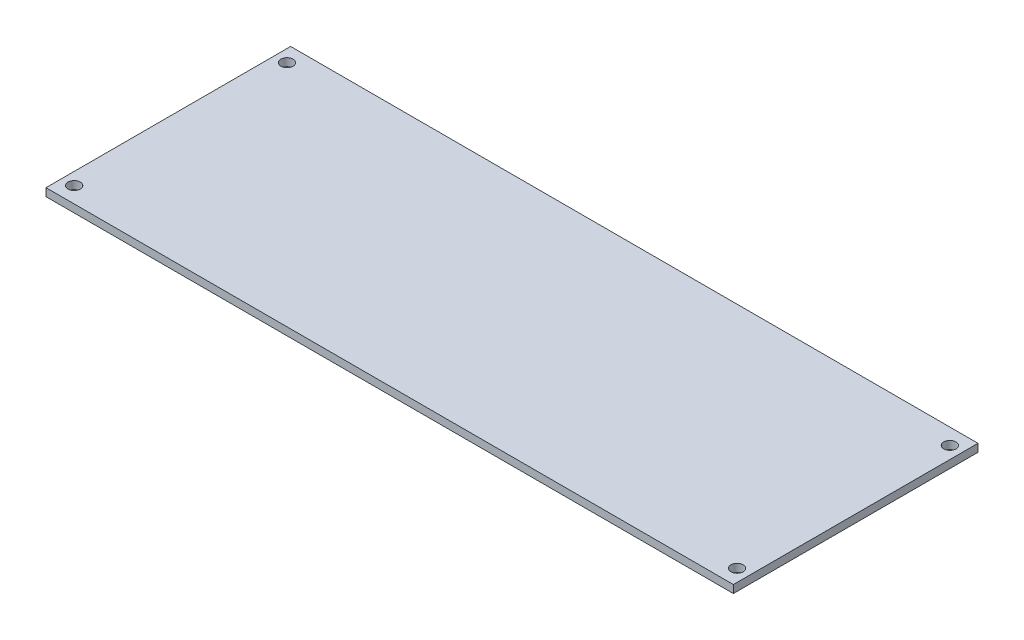
ISO-10303-21;
HEADER;
FILE_DESCRIPTION(('STEP AP214'),'2;1');
FILE_NAME('part.step','',(''),(''),'','','');
FILE_SCHEMA(('AUTOMOTIVE_DESIGN { 1 0 10303 214 1 1 1 1 }'));
ENDSEC;
DATA;
#1=APPLICATION_CONTEXT('core data for automotive mechanical design processes');
#2=APPLICATION_PROTOCOL_DEFINITION('international standard','automotive_design',2000,#1);
#3=PRODUCT_CONTEXT('',#1,'mechanical');
#4=PRODUCT('Part','Part','',(#3));
#5=PRODUCT_RELATED_PRODUCT_CATEGORY('part','',(#4));
#6=PRODUCT_DEFINITION_FORMATION('','',#4);
#7=PRODUCT_DEFINITION_CONTEXT('part definition',#1,'design');
#8=PRODUCT_DEFINITION('design','',#6,#7);
#9=PRODUCT_DEFINITION_SHAPE('','',#8);
#10=(LENGTH_UNIT() NAMED_UNIT(*) SI_UNIT(.MILLI.,.METRE.));
#11=(NAMED_UNIT(*) PLANE_ANGLE_UNIT() SI_UNIT($,.RADIAN.));
#12=(NAMED_UNIT(*) SI_UNIT($,.STERADIAN.) SOLID_ANGLE_UNIT());
#13=UNCERTAINTY_MEASURE_WITH_UNIT(LENGTH_MEASURE(1.E-05),#10,'distance_accuracy_value','');
#14=(GEOMETRIC_REPRESENTATION_CONTEXT(3) GLOBAL_UNCERTAINTY_ASSIGNED_CONTEXT((#13)) GLOBAL_UNIT_ASSIGNED_CONTEXT((#10,
#11,#12)) REPRESENTATION_CONTEXT('',''));
#15=CARTESIAN_POINT('',(0.,0.,0.));
#16=DIRECTION('',(0.,0.,1.));
#17=DIRECTION('',(1.,0.,0.));
#18=AXIS2_PLACEMENT_3D('',#15,#16,#17);
#19=CARTESIAN_POINT('',(0.,1.6,0.));
#20=DIRECTION('',(0.,1.,0.));
#21=DIRECTION('',(0.,0.,1.));
#22=AXIS2_PLACEMENT_3D('',#19,#20,#21);
#23=PLANE('',#22);
#24=CARTESIAN_POINT('',(67.75,1.6,21.75));
#25=DIRECTION('',(0.,1.,0.));
#26=DIRECTION('',(0.,0.,1.));
#27=AXIS2_PLACEMENT_3D('',#24,#25,#26);
#28=CIRCLE('',#27,1.25);
#29=CARTESIAN_POINT('',(67.75,1.6,23.));
#30=VERTEX_POINT('',#29);
#31=EDGE_CURVE('E142',#30,#30,#28,.T.);
#32=ORIENTED_EDGE('',*,*,#31,.F.);
#33=EDGE_LOOP('',(#32));
#34=FACE_BOUND('',#33,.T.);
#35=CARTESIAN_POINT('',(-67.75,1.6,-21.75));
#36=DIRECTION('',(0.,1.,0.));
#37=DIRECTION('',(0.,0.,1.));
#38=AXIS2_PLACEMENT_3D('',#35,#36,#37);
#39=CIRCLE('',#38,1.25);
#40=CARTESIAN_POINT('',(-67.75,1.6,-20.5));
#41=VERTEX_POINT('',#40);
#42=EDGE_CURVE('E112',#41,#41,#39,.T.);
#43=ORIENTED_EDGE('',*,*,#42,.F.);
#44=EDGE_LOOP('',(#43));
#45=FACE_BOUND('',#44,.T.);
#46=DIRECTION('',(0.,0.,-1.));
#47=VECTOR('',#46,1.);
#48=CARTESIAN_POINT('',(70.25,1.6,-25.));
#49=LINE('',#48,#47);
#50=CARTESIAN_POINT('',(70.25,1.6,25.));
#51=VERTEX_POINT('',#50);
#52=CARTESIAN_POINT('',(70.25,1.6,-25.));
#53=VERTEX_POINT('',#52);
#54=EDGE_CURVE('E92',#51,#53,#49,.T.);
#55=ORIENTED_EDGE('',*,*,#54,.T.);
#56=DIRECTION('',(-1.,0.,0.));
#57=VECTOR('',#56,1.);
#58=CARTESIAN_POINT('',(-70.25,1.6,-25.));
#59=LINE('',#58,#57);
#60=CARTESIAN_POINT('',(-70.25,1.6,-25.));
#61=VERTEX_POINT('',#60);
#62=EDGE_CURVE('E87',#53,#61,#59,.T.);
#63=ORIENTED_EDGE('',*,*,#62,.T.);
#64=DIRECTION('',(0.,0.,1.));
#65=VECTOR('',#64,1.);
#66=CARTESIAN_POINT('',(-70.25,1.6,-25.));
#67=LINE('',#66,#65);
#68=CARTESIAN_POINT('',(-70.25,1.6,25.));
#69=VERTEX_POINT('',#68);
#70=EDGE_CURVE('E90',#61,#69,#67,.T.);
#71=ORIENTED_EDGE('',*,*,#70,.T.);
#72=DIRECTION('',(1.,0.,0.));
#73=VECTOR('',#72,1.);
#74=CARTESIAN_POINT('',(-70.25,1.6,25.));
#75=LINE('',#74,#73);
#76=EDGE_CURVE('E57',#69,#51,#75,.T.);
#77=ORIENTED_EDGE('',*,*,#76,.T.);
#78=EDGE_LOOP('',(#55,#63,#71,#77));
#79=FACE_BOUND('',#78,.T.);
#80=CARTESIAN_POINT('',(67.75,1.6,-21.75));
#81=DIRECTION('',(0.,1.,0.));
#82=DIRECTION('',(0.,0.,-1.));
#83=AXIS2_PLACEMENT_3D('',#80,#81,#82);
#84=CIRCLE('',#83,1.25);
#85=CARTESIAN_POINT('',(67.75,1.6,-23.));
#86=VERTEX_POINT('',#85);
#87=EDGE_CURVE('E134',#86,#86,#84,.T.);
#88=ORIENTED_EDGE('',*,*,#87,.F.);
#89=EDGE_LOOP('',(#88));
#90=FACE_BOUND('',#89,.T.);
#91=CARTESIAN_POINT('',(-67.75,1.6,21.75));
#92=DIRECTION('',(0.,1.,0.));
#93=DIRECTION('',(0.,0.,-1.));
#94=AXIS2_PLACEMENT_3D('',#91,#92,#93);
#95=CIRCLE('',#94,1.25);
#96=CARTESIAN_POINT('',(-67.75,1.6,20.5));
#97=VERTEX_POINT('',#96);
#98=EDGE_CURVE('E150',#97,#97,#95,.T.);
#99=ORIENTED_EDGE('',*,*,#98,.F.);
#100=EDGE_LOOP('',(#99));
#101=FACE_BOUND('',#100,.T.);
#102=ADVANCED_FACE('F39',(#34,#45,#79,#90,#101),#23,.T.);
#103=CARTESIAN_POINT('',(0.,0.,0.));
#104=DIRECTION('',(0.,1.,0.));
#105=DIRECTION('',(0.,0.,1.));
#106=AXIS2_PLACEMENT_3D('',#103,#104,#105);
#107=PLANE('',#106);
#108=DIRECTION('',(0.,0.,-1.));
#109=VECTOR('',#108,1.);
#110=CARTESIAN_POINT('',(70.25,0.,-25.));
#111=LINE('',#110,#109);
#112=CARTESIAN_POINT('',(70.25,0.,25.));
#113=VERTEX_POINT('',#112);
#114=CARTESIAN_POINT('',(70.25,0.,-25.));
#115=VERTEX_POINT('',#114);
#116=EDGE_CURVE('E108',#113,#115,#111,.T.);
#117=ORIENTED_EDGE('',*,*,#116,.F.);
#118=DIRECTION('',(1.,0.,0.));
#119=VECTOR('',#118,1.);
#120=CARTESIAN_POINT('',(-70.25,0.,25.));
#121=LINE('',#120,#119);
#122=CARTESIAN_POINT('',(-70.25,0.,25.));
#123=VERTEX_POINT('',#122);
#124=EDGE_CURVE('E80',#123,#113,#121,.T.);
#125=ORIENTED_EDGE('',*,*,#124,.F.);
#126=DIRECTION('',(0.,0.,1.));
#127=VECTOR('',#126,1.);
#128=CARTESIAN_POINT('',(-70.25,0.,-25.));
#129=LINE('',#128,#127);
#130=CARTESIAN_POINT('',(-70.25,0.,-25.));
#131=VERTEX_POINT('',#130);
#132=EDGE_CURVE('E74',#131,#123,#129,.T.);
#133=ORIENTED_EDGE('',*,*,#132,.F.);
#134=DIRECTION('',(-1.,0.,0.));
#135=VECTOR('',#134,1.);
#136=CARTESIAN_POINT('',(-70.25,0.,-25.));
#137=LINE('',#136,#135);
#138=EDGE_CURVE('E97',#115,#131,#137,.T.);
#139=ORIENTED_EDGE('',*,*,#138,.F.);
#140=EDGE_LOOP('',(#117,#125,#133,#139));
#141=FACE_BOUND('',#140,.T.);
#142=CARTESIAN_POINT('',(-67.75,0.,-21.75));
#143=DIRECTION('',(0.,1.,0.));
#144=DIRECTION('',(0.,0.,1.));
#145=AXIS2_PLACEMENT_3D('',#142,#143,#144);
#146=CIRCLE('',#145,1.25);
#147=CARTESIAN_POINT('',(-67.75,0.,-20.5));
#148=VERTEX_POINT('',#147);
#149=EDGE_CURVE('E130',#148,#148,#146,.T.);
#150=ORIENTED_EDGE('',*,*,#149,.T.);
#151=EDGE_LOOP('',(#150));
#152=FACE_BOUND('',#151,.T.);
#153=CARTESIAN_POINT('',(67.75,0.,-21.75));
#154=DIRECTION('',(0.,1.,0.));
#155=DIRECTION('',(0.,0.,-1.));
#156=AXIS2_PLACEMENT_3D('',#153,#154,#155);
#157=CIRCLE('',#156,1.25);
#158=CARTESIAN_POINT('',(67.75,0.,-23.));
#159=VERTEX_POINT('',#158);
#160=EDGE_CURVE('E138',#159,#159,#157,.T.);
#161=ORIENTED_EDGE('',*,*,#160,.T.);
#162=EDGE_LOOP('',(#161));
#163=FACE_BOUND('',#162,.T.);
#164=CARTESIAN_POINT('',(67.75,0.,21.75));
#165=DIRECTION('',(0.,1.,0.));
#166=DIRECTION('',(0.,0.,1.));
#167=AXIS2_PLACEMENT_3D('',#164,#165,#166);
#168=CIRCLE('',#167,1.25);
#169=CARTESIAN_POINT('',(67.75,0.,23.));
#170=VERTEX_POINT('',#169);
#171=EDGE_CURVE('E146',#170,#170,#168,.T.);
#172=ORIENTED_EDGE('',*,*,#171,.T.);
#173=EDGE_LOOP('',(#172));
#174=FACE_BOUND('',#173,.T.);
#175=CARTESIAN_POINT('',(-67.75,0.,21.75));
#176=DIRECTION('',(0.,1.,0.));
#177=DIRECTION('',(0.,0.,-1.));
#178=AXIS2_PLACEMENT_3D('',#175,#176,#177);
#179=CIRCLE('',#178,1.25);
#180=CARTESIAN_POINT('',(-67.75,0.,20.5));
#181=VERTEX_POINT('',#180);
#182=EDGE_CURVE('E154',#181,#181,#179,.T.);
#183=ORIENTED_EDGE('',*,*,#182,.T.);
#184=EDGE_LOOP('',(#183));
#185=FACE_BOUND('',#184,.T.);
#186=ADVANCED_FACE('F125',(#141,#152,#163,#174,#185),#107,.F.);
#187=CARTESIAN_POINT('',(70.25,1.6,-25.));
#188=DIRECTION('',(-1.,0.,0.));
#189=DIRECTION('',(0.,0.,1.));
#190=AXIS2_PLACEMENT_3D('',#187,#188,#189);
#191=PLANE('',#190);
#192=ORIENTED_EDGE('',*,*,#116,.T.);
#193=DIRECTION('',(0.,-1.,0.));
#194=VECTOR('',#193,1.);
#195=CARTESIAN_POINT('',(70.25,1.6,-25.));
#196=LINE('',#195,#194);
#197=EDGE_CURVE('E11',#53,#115,#196,.T.);
#198=ORIENTED_EDGE('',*,*,#197,.F.);
#199=ORIENTED_EDGE('',*,*,#54,.F.);
#200=DIRECTION('',(0.,-1.,0.));
#201=VECTOR('',#200,1.);
#202=CARTESIAN_POINT('',(70.25,1.6,25.));
#203=LINE('',#202,#201);
#204=EDGE_CURVE('E104',#51,#113,#203,.T.);
#205=ORIENTED_EDGE('',*,*,#204,.T.);
#206=EDGE_LOOP('',(#192,#198,#199,#205));
#207=FACE_BOUND('',#206,.T.);
#208=ADVANCED_FACE('F41',(#207),#191,.F.);
#209=CARTESIAN_POINT('',(-70.25,1.6,-25.));
#210=DIRECTION('',(0.,0.,1.));
#211=DIRECTION('',(1.,0.,0.));
#212=AXIS2_PLACEMENT_3D('',#209,#210,#211);
#213=PLANE('',#212);
#214=ORIENTED_EDGE('',*,*,#138,.T.);
#215=DIRECTION('',(0.,-1.,0.));
#216=VECTOR('',#215,1.);
#217=CARTESIAN_POINT('',(-70.25,1.6,-25.));
#218=LINE('',#217,#216);
#219=EDGE_CURVE('E49',#61,#131,#218,.T.);
#220=ORIENTED_EDGE('',*,*,#219,.F.);
#221=ORIENTED_EDGE('',*,*,#62,.F.);
#222=ORIENTED_EDGE('',*,*,#197,.T.);
#223=EDGE_LOOP('',(#214,#220,#221,#222));
#224=FACE_BOUND('',#223,.T.);
#225=ADVANCED_FACE('F96',(#224),#213,.F.);
#226=CARTESIAN_POINT('',(-70.25,1.6,-25.));
#227=DIRECTION('',(1.,0.,0.));
#228=DIRECTION('',(0.,0.,-1.));
#229=AXIS2_PLACEMENT_3D('',#226,#227,#228);
#230=PLANE('',#229);
#231=ORIENTED_EDGE('',*,*,#132,.T.);
#232=DIRECTION('',(0.,-1.,0.));
#233=VECTOR('',#232,1.);
#234=CARTESIAN_POINT('',(-70.25,1.6,25.));
#235=LINE('',#234,#233);
#236=EDGE_CURVE('E99',#69,#123,#235,.T.);
#237=ORIENTED_EDGE('',*,*,#236,.F.);
#238=ORIENTED_EDGE('',*,*,#70,.F.);
#239=ORIENTED_EDGE('',*,*,#219,.T.);
#240=EDGE_LOOP('',(#231,#237,#238,#239));
#241=FACE_BOUND('',#240,.T.);
#242=ADVANCED_FACE('F100',(#241),#230,.F.);
#243=CARTESIAN_POINT('',(-70.25,1.6,25.));
#244=DIRECTION('',(0.,0.,-1.));
#245=DIRECTION('',(-1.,0.,0.));
#246=AXIS2_PLACEMENT_3D('',#243,#244,#245);
#247=PLANE('',#246);
#248=ORIENTED_EDGE('',*,*,#124,.T.);
#249=ORIENTED_EDGE('',*,*,#204,.F.);
#250=ORIENTED_EDGE('',*,*,#76,.F.);
#251=ORIENTED_EDGE('',*,*,#236,.T.);
#252=EDGE_LOOP('',(#248,#249,#250,#251));
#253=FACE_BOUND('',#252,.T.);
#254=ADVANCED_FACE('F122',(#253),#247,.F.);
#255=CARTESIAN_POINT('',(-67.75,1.6,-21.75));
#256=DIRECTION('',(0.,-1.,0.));
#257=DIRECTION('',(0.,0.,-1.));
#258=AXIS2_PLACEMENT_3D('',#255,#256,#257);
#259=CYLINDRICAL_SURFACE('',#258,1.25);
#260=ORIENTED_EDGE('',*,*,#42,.T.);
#261=EDGE_LOOP('',(#260));
#262=FACE_BOUND('',#261,.T.);
#263=ORIENTED_EDGE('',*,*,#149,.F.);
#264=EDGE_LOOP('',(#263));
#265=FACE_BOUND('',#264,.T.);
#266=ADVANCED_FACE('F175',(#262,#265),#259,.F.);
#267=CARTESIAN_POINT('',(67.75,1.6,-21.75));
#268=DIRECTION('',(0.,-1.,0.));
#269=DIRECTION('',(0.,0.,-1.));
#270=AXIS2_PLACEMENT_3D('',#267,#268,#269);
#271=CYLINDRICAL_SURFACE('',#270,1.25);
#272=ORIENTED_EDGE('',*,*,#87,.T.);
#273=EDGE_LOOP('',(#272));
#274=FACE_BOUND('',#273,.T.);
#275=ORIENTED_EDGE('',*,*,#160,.F.);
#276=EDGE_LOOP('',(#275));
#277=FACE_BOUND('',#276,.T.);
#278=ADVANCED_FACE('F221',(#274,#277),#271,.F.);
#279=CARTESIAN_POINT('',(67.75,1.6,21.75));
#280=DIRECTION('',(0.,-1.,0.));
#281=DIRECTION('',(0.,0.,-1.));
#282=AXIS2_PLACEMENT_3D('',#279,#280,#281);
#283=CYLINDRICAL_SURFACE('',#282,1.25);
#284=ORIENTED_EDGE('',*,*,#31,.T.);
#285=EDGE_LOOP('',(#284));
#286=FACE_BOUND('',#285,.T.);
#287=ORIENTED_EDGE('',*,*,#171,.F.);
#288=EDGE_LOOP('',(#287));
#289=FACE_BOUND('',#288,.T.);
#290=ADVANCED_FACE('F229',(#286,#289),#283,.F.);
#291=CARTESIAN_POINT('',(-67.75,1.6,21.75));
#292=DIRECTION('',(0.,-1.,0.));
#293=DIRECTION('',(0.,0.,-1.));
#294=AXIS2_PLACEMENT_3D('',#291,#292,#293);
#295=CYLINDRICAL_SURFACE('',#294,1.25);
#296=ORIENTED_EDGE('',*,*,#98,.T.);
#297=EDGE_LOOP('',(#296));
#298=FACE_BOUND('',#297,.T.);
#299=ORIENTED_EDGE('',*,*,#182,.F.);
#300=EDGE_LOOP('',(#299));
#301=FACE_BOUND('',#300,.T.);
#302=ADVANCED_FACE('F162',(#298,#301),#295,.F.);
#303=CLOSED_SHELL('',(#102,#186,#208,#225,#242,#254,#266,#278,#290,#302));
#304=MANIFOLD_SOLID_BREP('B2',#303);
#305=ADVANCED_BREP_SHAPE_REPRESENTATION('',(#18,#304),#14);
#306=SHAPE_DEFINITION_REPRESENTATION(#9,#305);
ENDSEC;
END-ISO-10303-21;
